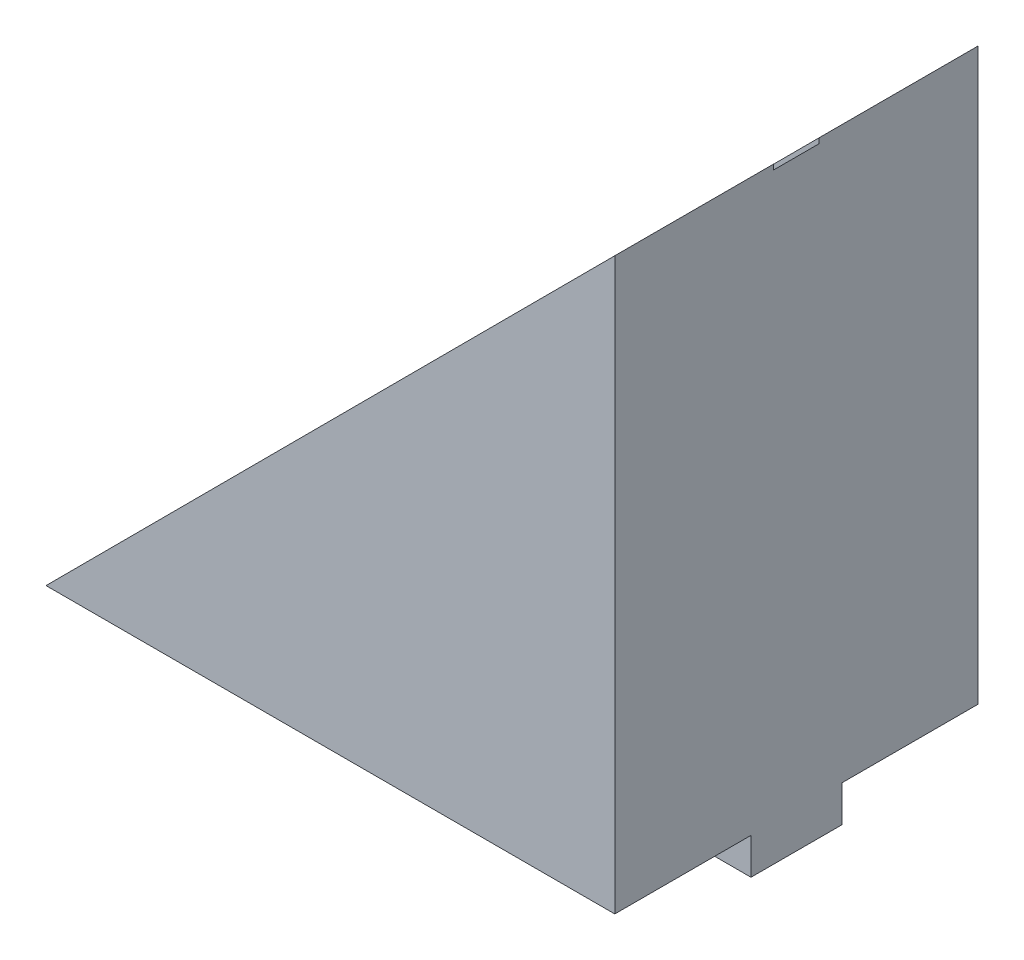
ISO-10303-21;
HEADER;
FILE_DESCRIPTION(('STEP AP214'),'2;1');
FILE_NAME('part.step','',(''),(''),'','','');
FILE_SCHEMA(('AUTOMOTIVE_DESIGN { 1 0 10303 214 1 1 1 1 }'));
ENDSEC;
DATA;
#1=APPLICATION_CONTEXT('core data for automotive mechanical design processes');
#2=APPLICATION_PROTOCOL_DEFINITION('international standard','automotive_design',2000,#1);
#3=PRODUCT_CONTEXT('',#1,'mechanical');
#4=PRODUCT('Part','Part','',(#3));
#5=PRODUCT_RELATED_PRODUCT_CATEGORY('part','',(#4));
#6=PRODUCT_DEFINITION_FORMATION('','',#4);
#7=PRODUCT_DEFINITION_CONTEXT('part definition',#1,'design');
#8=PRODUCT_DEFINITION('design','',#6,#7);
#9=PRODUCT_DEFINITION_SHAPE('','',#8);
#10=(LENGTH_UNIT() NAMED_UNIT(*) SI_UNIT(.MILLI.,.METRE.));
#11=(NAMED_UNIT(*) PLANE_ANGLE_UNIT() SI_UNIT($,.RADIAN.));
#12=(NAMED_UNIT(*) SI_UNIT($,.STERADIAN.) SOLID_ANGLE_UNIT());
#13=UNCERTAINTY_MEASURE_WITH_UNIT(LENGTH_MEASURE(1.E-05),#10,'distance_accuracy_value','');
#14=(GEOMETRIC_REPRESENTATION_CONTEXT(3) GLOBAL_UNCERTAINTY_ASSIGNED_CONTEXT((#13)) GLOBAL_UNIT_ASSIGNED_CONTEXT((#10,
#11,#12)) REPRESENTATION_CONTEXT('',''));
#15=CARTESIAN_POINT('',(0.,0.,0.));
#16=DIRECTION('',(0.,0.,1.));
#17=DIRECTION('',(1.,0.,0.));
#18=AXIS2_PLACEMENT_3D('',#15,#16,#17);
#19=CARTESIAN_POINT('',(39.7752817316431,39.8648656995072,25.4));
#20=DIRECTION('',(0.707901729033969,-0.706310938631646,0.));
#21=DIRECTION('',(0.706310938631646,0.707901729033969,0.));
#22=AXIS2_PLACEMENT_3D('',#19,#20,#21);
#23=PLANE('',#22);
#24=DIRECTION('',(0.,0.,-1.));
#25=VECTOR('',#24,1.);
#26=CARTESIAN_POINT('',(39.7752817316431,39.8648656995072,25.4));
#27=LINE('',#26,#25);
#28=CARTESIAN_POINT('',(39.7752817316431,39.8648656995072,25.4));
#29=VERTEX_POINT('',#28);
#30=CARTESIAN_POINT('',(39.7752817316431,39.8648656995072,14.2875));
#31=VERTEX_POINT('',#30);
#32=EDGE_CURVE('E230',#29,#31,#27,.T.);
#33=ORIENTED_EDGE('',*,*,#32,.T.);
#34=DIRECTION('',(0.706310938631646,0.707901729033969,0.));
#35=VECTOR('',#34,1.);
#36=CARTESIAN_POINT('',(39.7752817316431,39.8648656995072,14.2875));
#37=LINE('',#36,#35);
#38=CARTESIAN_POINT('',(0.,0.,14.2875));
#39=VERTEX_POINT('',#38);
#40=EDGE_CURVE('E134',#39,#31,#37,.T.);
#41=ORIENTED_EDGE('',*,*,#40,.F.);
#42=DIRECTION('',(0.,0.,-1.));
#43=VECTOR('',#42,1.);
#44=CARTESIAN_POINT('',(0.,0.,9.525));
#45=LINE('',#44,#43);
#46=CARTESIAN_POINT('',(0.,0.,15.875));
#47=VERTEX_POINT('',#46);
#48=EDGE_CURVE('E172',#47,#39,#45,.T.);
#49=ORIENTED_EDGE('',*,*,#48,.F.);
#50=DIRECTION('',(0.,0.,-1.));
#51=VECTOR('',#50,1.);
#52=CARTESIAN_POINT('',(0.,0.,25.4));
#53=LINE('',#52,#51);
#54=CARTESIAN_POINT('',(0.,0.,25.4));
#55=VERTEX_POINT('',#54);
#56=EDGE_CURVE('E48',#55,#47,#53,.T.);
#57=ORIENTED_EDGE('',*,*,#56,.F.);
#58=DIRECTION('',(-0.706310938631646,-0.707901729033969,0.));
#59=VECTOR('',#58,1.);
#60=CARTESIAN_POINT('',(39.7752817316431,39.8648656995072,25.4));
#61=LINE('',#60,#59);
#62=EDGE_CURVE('E208',#29,#55,#61,.T.);
#63=ORIENTED_EDGE('',*,*,#62,.F.);
#64=EDGE_LOOP('',(#33,#41,#49,#57,#63));
#65=FACE_BOUND('',#64,.T.);
#66=ADVANCED_FACE('F39',(#65),#23,.F.);
#67=CARTESIAN_POINT('',(23.0626408658216,0.,25.4));
#68=DIRECTION('',(0.,1.,0.));
#69=DIRECTION('',(0.,0.,1.));
#70=AXIS2_PLACEMENT_3D('',#67,#68,#69);
#71=PLANE('',#70);
#72=DIRECTION('',(1.,0.,0.));
#73=VECTOR('',#72,1.);
#74=CARTESIAN_POINT('',(39.7752817316431,0.,9.525));
#75=LINE('',#74,#73);
#76=CARTESIAN_POINT('',(0.,0.,9.525));
#77=VERTEX_POINT('',#76);
#78=CARTESIAN_POINT('',(39.7752817316431,0.,9.525));
#79=VERTEX_POINT('',#78);
#80=EDGE_CURVE('E166',#77,#79,#75,.T.);
#81=ORIENTED_EDGE('',*,*,#80,.F.);
#82=CARTESIAN_POINT('',(0.,0.,0.));
#83=VERTEX_POINT('',#82);
#84=EDGE_CURVE('E238',#77,#83,#53,.T.);
#85=ORIENTED_EDGE('',*,*,#84,.T.);
#86=DIRECTION('',(1.,0.,0.));
#87=VECTOR('',#86,1.);
#88=CARTESIAN_POINT('',(23.0626408658216,0.,0.));
#89=LINE('',#88,#87);
#90=CARTESIAN_POINT('',(39.7752817316431,0.,0.));
#91=VERTEX_POINT('',#90);
#92=EDGE_CURVE('E223',#83,#91,#89,.T.);
#93=ORIENTED_EDGE('',*,*,#92,.T.);
#94=DIRECTION('',(0.,0.,-1.));
#95=VECTOR('',#94,1.);
#96=CARTESIAN_POINT('',(39.7752817316431,0.,25.4));
#97=LINE('',#96,#95);
#98=EDGE_CURVE('E234',#79,#91,#97,.T.);
#99=ORIENTED_EDGE('',*,*,#98,.F.);
#100=EDGE_LOOP('',(#81,#85,#93,#99));
#101=FACE_BOUND('',#100,.T.);
#102=ADVANCED_FACE('F247',(#101),#71,.F.);
#103=DIRECTION('',(-1.,0.,0.));
#104=VECTOR('',#103,1.);
#105=CARTESIAN_POINT('',(0.,0.,15.875));
#106=LINE('',#105,#104);
#107=CARTESIAN_POINT('',(39.7752817316431,0.,15.875));
#108=VERTEX_POINT('',#107);
#109=EDGE_CURVE('E185',#108,#47,#106,.T.);
#110=ORIENTED_EDGE('',*,*,#109,.F.);
#111=CARTESIAN_POINT('',(39.7752817316431,0.,25.4));
#112=VERTEX_POINT('',#111);
#113=EDGE_CURVE('E235',#112,#108,#97,.T.);
#114=ORIENTED_EDGE('',*,*,#113,.F.);
#115=DIRECTION('',(1.,0.,0.));
#116=VECTOR('',#115,1.);
#117=CARTESIAN_POINT('',(0.,0.,25.4));
#118=LINE('',#117,#116);
#119=EDGE_CURVE('E212',#55,#112,#118,.T.);
#120=ORIENTED_EDGE('',*,*,#119,.F.);
#121=ORIENTED_EDGE('',*,*,#56,.T.);
#122=EDGE_LOOP('',(#110,#114,#120,#121));
#123=FACE_BOUND('',#122,.T.);
#124=ADVANCED_FACE('F273',(#123),#71,.F.);
#125=CARTESIAN_POINT('',(0.,0.,11.1125));
#126=VERTEX_POINT('',#125);
#127=EDGE_CURVE('E63',#126,#77,#45,.T.);
#128=ORIENTED_EDGE('',*,*,#127,.F.);
#129=DIRECTION('',(-0.706310938631646,-0.707901729033969,0.));
#130=VECTOR('',#129,1.);
#131=CARTESIAN_POINT('',(39.7752817316431,39.8648656995072,11.1125));
#132=LINE('',#131,#130);
#133=CARTESIAN_POINT('',(39.7752817316431,39.8648656995072,11.1125));
#134=VERTEX_POINT('',#133);
#135=EDGE_CURVE('E55',#134,#126,#132,.T.);
#136=ORIENTED_EDGE('',*,*,#135,.F.);
#137=CARTESIAN_POINT('',(39.7752817316431,39.8648656995072,0.));
#138=VERTEX_POINT('',#137);
#139=EDGE_CURVE('E219',#134,#138,#27,.T.);
#140=ORIENTED_EDGE('',*,*,#139,.T.);
#141=DIRECTION('',(-0.706310938631646,-0.707901729033969,0.));
#142=VECTOR('',#141,1.);
#143=CARTESIAN_POINT('',(39.7752817316431,39.8648656995072,0.));
#144=LINE('',#143,#142);
#145=EDGE_CURVE('E207',#138,#83,#144,.T.);
#146=ORIENTED_EDGE('',*,*,#145,.T.);
#147=ORIENTED_EDGE('',*,*,#84,.F.);
#148=EDGE_LOOP('',(#128,#136,#140,#146,#147));
#149=FACE_BOUND('',#148,.T.);
#150=ADVANCED_FACE('F41',(#149),#23,.F.);
#151=CARTESIAN_POINT('',(39.7752817316431,0.,25.4));
#152=DIRECTION('',(-1.,0.,0.));
#153=DIRECTION('',(0.,0.,1.));
#154=AXIS2_PLACEMENT_3D('',#151,#152,#153);
#155=PLANE('',#154);
#156=DIRECTION('',(0.,0.,1.));
#157=VECTOR('',#156,1.);
#158=CARTESIAN_POINT('',(39.7752817316431,39.5052507111112,25.4));
#159=LINE('',#158,#157);
#160=CARTESIAN_POINT('',(39.7752817316431,39.5052507111112,11.1125));
#161=VERTEX_POINT('',#160);
#162=CARTESIAN_POINT('',(39.7752817316431,39.5052507111112,14.2875));
#163=VERTEX_POINT('',#162);
#164=EDGE_CURVE('E11',#161,#163,#159,.T.);
#165=ORIENTED_EDGE('',*,*,#164,.T.);
#166=DIRECTION('',(0.,1.,0.));
#167=VECTOR('',#166,1.);
#168=CARTESIAN_POINT('',(39.7752817316431,0.,14.2875));
#169=LINE('',#168,#167);
#170=EDGE_CURVE('E162',#163,#31,#169,.T.);
#171=ORIENTED_EDGE('',*,*,#170,.T.);
#172=ORIENTED_EDGE('',*,*,#32,.F.);
#173=DIRECTION('',(0.,1.,0.));
#174=VECTOR('',#173,1.);
#175=CARTESIAN_POINT('',(39.7752817316431,0.,25.4));
#176=LINE('',#175,#174);
#177=EDGE_CURVE('E216',#112,#29,#176,.T.);
#178=ORIENTED_EDGE('',*,*,#177,.F.);
#179=ORIENTED_EDGE('',*,*,#113,.T.);
#180=DIRECTION('',(0.,1.,0.));
#181=VECTOR('',#180,1.);
#182=CARTESIAN_POINT('',(39.7752817316431,-2.54,15.875));
#183=LINE('',#182,#181);
#184=CARTESIAN_POINT('',(39.7752817316431,-2.54,15.875));
#185=VERTEX_POINT('',#184);
#186=EDGE_CURVE('E199',#185,#108,#183,.T.);
#187=ORIENTED_EDGE('',*,*,#186,.F.);
#188=DIRECTION('',(0.,0.,1.));
#189=VECTOR('',#188,1.);
#190=CARTESIAN_POINT('',(39.7752817316431,-2.54,15.875));
#191=LINE('',#190,#189);
#192=CARTESIAN_POINT('',(39.7752817316431,-2.54,9.525));
#193=VERTEX_POINT('',#192);
#194=EDGE_CURVE('E171',#193,#185,#191,.T.);
#195=ORIENTED_EDGE('',*,*,#194,.F.);
#196=DIRECTION('',(0.,1.,0.));
#197=VECTOR('',#196,1.);
#198=CARTESIAN_POINT('',(39.7752817316431,-2.54,9.525));
#199=LINE('',#198,#197);
#200=EDGE_CURVE('E203',#193,#79,#199,.T.);
#201=ORIENTED_EDGE('',*,*,#200,.T.);
#202=ORIENTED_EDGE('',*,*,#98,.T.);
#203=DIRECTION('',(0.,1.,0.));
#204=VECTOR('',#203,1.);
#205=CARTESIAN_POINT('',(39.7752817316431,0.,0.));
#206=LINE('',#205,#204);
#207=EDGE_CURVE('E213',#91,#138,#206,.T.);
#208=ORIENTED_EDGE('',*,*,#207,.T.);
#209=ORIENTED_EDGE('',*,*,#139,.F.);
#210=DIRECTION('',(0.,-1.,0.));
#211=VECTOR('',#210,1.);
#212=CARTESIAN_POINT('',(39.7752817316431,0.,11.1125));
#213=LINE('',#212,#211);
#214=EDGE_CURVE('E158',#134,#161,#213,.T.);
#215=ORIENTED_EDGE('',*,*,#214,.T.);
#216=EDGE_LOOP('',(#165,#171,#172,#178,#179,#187,#195,#201,#202,#208,#209,#215));
#217=FACE_BOUND('',#216,.T.);
#218=ADVANCED_FACE('F256',(#217),#155,.F.);
#219=CARTESIAN_POINT('',(0.,0.,25.4));
#220=DIRECTION('',(0.,0.,1.));
#221=DIRECTION('',(1.,0.,0.));
#222=AXIS2_PLACEMENT_3D('',#219,#220,#221);
#223=PLANE('',#222);
#224=ORIENTED_EDGE('',*,*,#62,.T.);
#225=ORIENTED_EDGE('',*,*,#119,.T.);
#226=ORIENTED_EDGE('',*,*,#177,.T.);
#227=EDGE_LOOP('',(#224,#225,#226));
#228=FACE_BOUND('',#227,.T.);
#229=ADVANCED_FACE('F278',(#228),#223,.T.);
#230=CARTESIAN_POINT('',(0.,0.,0.));
#231=DIRECTION('',(0.,0.,1.));
#232=DIRECTION('',(1.,0.,0.));
#233=AXIS2_PLACEMENT_3D('',#230,#231,#232);
#234=PLANE('',#233);
#235=ORIENTED_EDGE('',*,*,#145,.F.);
#236=ORIENTED_EDGE('',*,*,#207,.F.);
#237=ORIENTED_EDGE('',*,*,#92,.F.);
#238=EDGE_LOOP('',(#235,#236,#237));
#239=FACE_BOUND('',#238,.T.);
#240=ADVANCED_FACE('F252',(#239),#234,.F.);
#241=CARTESIAN_POINT('',(39.7752817316431,-2.54,9.525));
#242=DIRECTION('',(0.,0.,1.));
#243=DIRECTION('',(1.,0.,0.));
#244=AXIS2_PLACEMENT_3D('',#241,#242,#243);
#245=PLANE('',#244);
#246=ORIENTED_EDGE('',*,*,#80,.T.);
#247=ORIENTED_EDGE('',*,*,#200,.F.);
#248=DIRECTION('',(1.,0.,0.));
#249=VECTOR('',#248,1.);
#250=CARTESIAN_POINT('',(39.7752817316431,-2.54,9.525));
#251=LINE('',#250,#249);
#252=CARTESIAN_POINT('',(0.,-2.54,9.525));
#253=VERTEX_POINT('',#252);
#254=EDGE_CURVE('E167',#253,#193,#251,.T.);
#255=ORIENTED_EDGE('',*,*,#254,.F.);
#256=DIRECTION('',(0.,1.,0.));
#257=VECTOR('',#256,1.);
#258=CARTESIAN_POINT('',(0.,-2.54,9.525));
#259=LINE('',#258,#257);
#260=EDGE_CURVE('E181',#253,#77,#259,.T.);
#261=ORIENTED_EDGE('',*,*,#260,.T.);
#262=EDGE_LOOP('',(#246,#247,#255,#261));
#263=FACE_BOUND('',#262,.T.);
#264=ADVANCED_FACE('F263',(#263),#245,.F.);
#265=CARTESIAN_POINT('',(0.,-2.54,15.875));
#266=DIRECTION('',(0.,0.,-1.));
#267=DIRECTION('',(-1.,0.,0.));
#268=AXIS2_PLACEMENT_3D('',#265,#266,#267);
#269=PLANE('',#268);
#270=ORIENTED_EDGE('',*,*,#109,.T.);
#271=DIRECTION('',(0.,1.,0.));
#272=VECTOR('',#271,1.);
#273=CARTESIAN_POINT('',(0.,-2.54,15.875));
#274=LINE('',#273,#272);
#275=CARTESIAN_POINT('',(0.,-2.54,15.875));
#276=VERTEX_POINT('',#275);
#277=EDGE_CURVE('E195',#276,#47,#274,.T.);
#278=ORIENTED_EDGE('',*,*,#277,.F.);
#279=DIRECTION('',(-1.,0.,0.));
#280=VECTOR('',#279,1.);
#281=CARTESIAN_POINT('',(0.,-2.54,15.875));
#282=LINE('',#281,#280);
#283=EDGE_CURVE('E175',#185,#276,#282,.T.);
#284=ORIENTED_EDGE('',*,*,#283,.F.);
#285=ORIENTED_EDGE('',*,*,#186,.T.);
#286=EDGE_LOOP('',(#270,#278,#284,#285));
#287=FACE_BOUND('',#286,.T.);
#288=ADVANCED_FACE('F271',(#287),#269,.F.);
#289=CARTESIAN_POINT('',(0.,-2.54,9.525));
#290=DIRECTION('',(1.,0.,0.));
#291=DIRECTION('',(0.,0.,-1.));
#292=AXIS2_PLACEMENT_3D('',#289,#290,#291);
#293=PLANE('',#292);
#294=ORIENTED_EDGE('',*,*,#48,.T.);
#295=DIRECTION('',(0.,0.,1.));
#296=VECTOR('',#295,1.);
#297=CARTESIAN_POINT('',(0.,0.,11.1125));
#298=LINE('',#297,#296);
#299=EDGE_CURVE('E152',#126,#39,#298,.T.);
#300=ORIENTED_EDGE('',*,*,#299,.F.);
#301=ORIENTED_EDGE('',*,*,#127,.T.);
#302=ORIENTED_EDGE('',*,*,#260,.F.);
#303=DIRECTION('',(0.,0.,-1.));
#304=VECTOR('',#303,1.);
#305=CARTESIAN_POINT('',(0.,-2.54,9.525));
#306=LINE('',#305,#304);
#307=EDGE_CURVE('E178',#276,#253,#306,.T.);
#308=ORIENTED_EDGE('',*,*,#307,.F.);
#309=ORIENTED_EDGE('',*,*,#277,.T.);
#310=EDGE_LOOP('',(#294,#300,#301,#302,#308,#309));
#311=FACE_BOUND('',#310,.T.);
#312=ADVANCED_FACE('F265',(#311),#293,.F.);
#313=CARTESIAN_POINT('',(0.,-2.54,0.));
#314=DIRECTION('',(0.,1.,0.));
#315=DIRECTION('',(0.,0.,1.));
#316=AXIS2_PLACEMENT_3D('',#313,#314,#315);
#317=PLANE('',#316);
#318=ORIENTED_EDGE('',*,*,#254,.T.);
#319=ORIENTED_EDGE('',*,*,#194,.T.);
#320=ORIENTED_EDGE('',*,*,#283,.T.);
#321=ORIENTED_EDGE('',*,*,#307,.T.);
#322=EDGE_LOOP('',(#318,#319,#320,#321));
#323=FACE_BOUND('',#322,.T.);
#324=ADVANCED_FACE('F268',(#323),#317,.F.);
#325=CARTESIAN_POINT('',(0.179807039174629,-0.179402978412438,0.));
#326=DIRECTION('',(0.707901729033969,-0.706310938631646,0.));
#327=DIRECTION('',(0.706310938631646,0.707901729033969,0.));
#328=AXIS2_PLACEMENT_3D('',#325,#326,#327);
#329=PLANE('',#328);
#330=DIRECTION('',(-0.706310938631646,-0.707901729033969,0.));
#331=VECTOR('',#330,1.);
#332=CARTESIAN_POINT('',(39.9550887708178,39.6854627210948,11.1125));
#333=LINE('',#332,#331);
#334=CARTESIAN_POINT('',(0.179807039174628,-0.179402978412439,11.1125));
#335=VERTEX_POINT('',#334);
#336=EDGE_CURVE('E126',#161,#335,#333,.T.);
#337=ORIENTED_EDGE('',*,*,#336,.T.);
#338=DIRECTION('',(0.,0.,1.));
#339=VECTOR('',#338,1.);
#340=CARTESIAN_POINT('',(0.179807039174628,-0.179402978412439,11.1125));
#341=LINE('',#340,#339);
#342=CARTESIAN_POINT('',(0.179807039174628,-0.179402978412439,14.2875));
#343=VERTEX_POINT('',#342);
#344=EDGE_CURVE('E130',#335,#343,#341,.T.);
#345=ORIENTED_EDGE('',*,*,#344,.T.);
#346=DIRECTION('',(0.706310938631646,0.707901729033969,0.));
#347=VECTOR('',#346,1.);
#348=CARTESIAN_POINT('',(39.9550887708178,39.6854627210948,14.2875));
#349=LINE('',#348,#347);
#350=EDGE_CURVE('E142',#343,#163,#349,.T.);
#351=ORIENTED_EDGE('',*,*,#350,.T.);
#352=ORIENTED_EDGE('',*,*,#164,.F.);
#353=EDGE_LOOP('',(#337,#345,#351,#352));
#354=FACE_BOUND('',#353,.T.);
#355=ADVANCED_FACE('F127',(#354),#329,.F.);
#356=CARTESIAN_POINT('',(39.9550887708178,39.6854627210948,14.2875));
#357=DIRECTION('',(0.,0.,1.));
#358=DIRECTION('',(0.,-1.,0.));
#359=AXIS2_PLACEMENT_3D('',#356,#357,#358);
#360=PLANE('',#359);
#361=ORIENTED_EDGE('',*,*,#350,.F.);
#362=DIRECTION('',(-0.707901729033969,0.706310938631646,0.));
#363=VECTOR('',#362,1.);
#364=CARTESIAN_POINT('',(0.179807039174628,-0.179402978412439,14.2875));
#365=LINE('',#364,#363);
#366=EDGE_CURVE('E141',#343,#39,#365,.T.);
#367=ORIENTED_EDGE('',*,*,#366,.T.);
#368=ORIENTED_EDGE('',*,*,#40,.T.);
#369=ORIENTED_EDGE('',*,*,#170,.F.);
#370=EDGE_LOOP('',(#361,#367,#368,#369));
#371=FACE_BOUND('',#370,.T.);
#372=ADVANCED_FACE('F282',(#371),#360,.F.);
#373=CARTESIAN_POINT('',(39.9550887708178,39.6854627210948,11.1125));
#374=DIRECTION('',(0.,0.,-1.));
#375=DIRECTION('',(0.,1.,0.));
#376=AXIS2_PLACEMENT_3D('',#373,#374,#375);
#377=PLANE('',#376);
#378=ORIENTED_EDGE('',*,*,#135,.T.);
#379=DIRECTION('',(-0.707901729033969,0.706310938631646,0.));
#380=VECTOR('',#379,1.);
#381=CARTESIAN_POINT('',(0.179807039174628,-0.179402978412439,11.1125));
#382=LINE('',#381,#380);
#383=EDGE_CURVE('E136',#335,#126,#382,.T.);
#384=ORIENTED_EDGE('',*,*,#383,.F.);
#385=ORIENTED_EDGE('',*,*,#336,.F.);
#386=ORIENTED_EDGE('',*,*,#214,.F.);
#387=EDGE_LOOP('',(#378,#384,#385,#386));
#388=FACE_BOUND('',#387,.T.);
#389=ADVANCED_FACE('F137',(#388),#377,.F.);
#390=CARTESIAN_POINT('',(0.179807039174628,-0.179402978412439,11.1125));
#391=DIRECTION('',(-0.706310938631646,-0.707901729033969,0.));
#392=DIRECTION('',(0.707901729033969,-0.706310938631646,0.));
#393=AXIS2_PLACEMENT_3D('',#390,#391,#392);
#394=PLANE('',#393);
#395=ORIENTED_EDGE('',*,*,#299,.T.);
#396=ORIENTED_EDGE('',*,*,#366,.F.);
#397=ORIENTED_EDGE('',*,*,#344,.F.);
#398=ORIENTED_EDGE('',*,*,#383,.T.);
#399=EDGE_LOOP('',(#395,#396,#397,#398));
#400=FACE_BOUND('',#399,.T.);
#401=ADVANCED_FACE('F144',(#400),#394,.F.);
#402=CLOSED_SHELL('',(#66,#102,#124,#150,#218,#229,#240,#264,#288,#312,#324,#355,#372,#389,#401));
#403=MANIFOLD_SOLID_BREP('B2',#402);
#404=ADVANCED_BREP_SHAPE_REPRESENTATION('',(#18,#403),#14);
#405=SHAPE_DEFINITION_REPRESENTATION(#9,#404);
ENDSEC;
END-ISO-10303-21;
